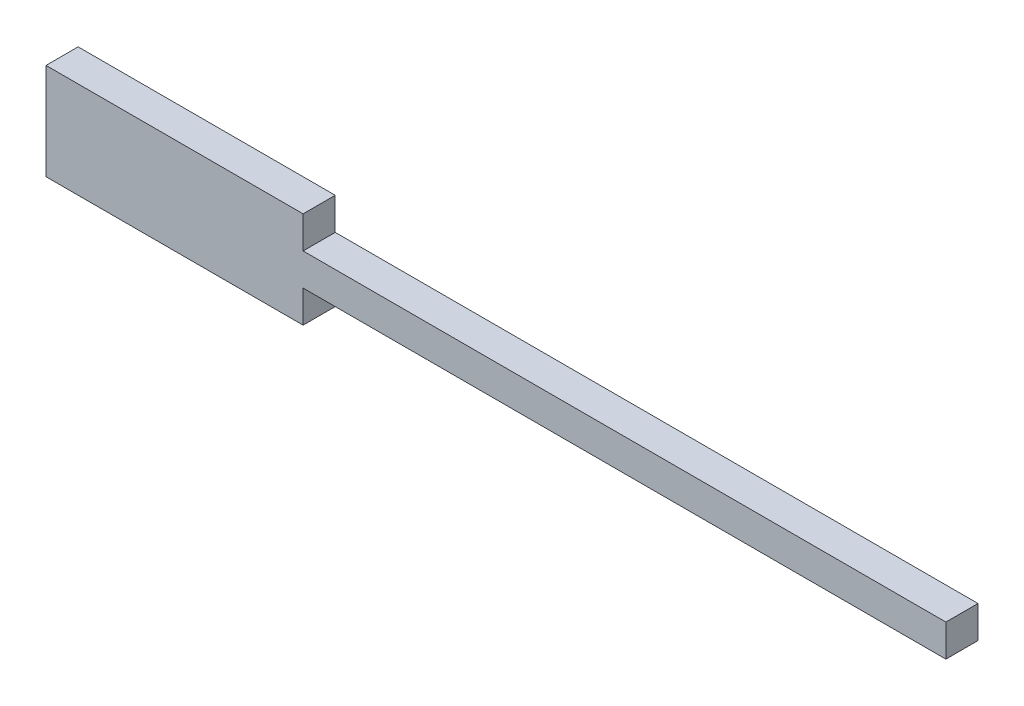
ISO-10303-21;
HEADER;
FILE_DESCRIPTION(('STEP AP214'),'2;1');
FILE_NAME('part.step','',(''),(''),'','','');
FILE_SCHEMA(('AUTOMOTIVE_DESIGN { 1 0 10303 214 1 1 1 1 }'));
ENDSEC;
DATA;
#1=APPLICATION_CONTEXT('core data for automotive mechanical design processes');
#2=APPLICATION_PROTOCOL_DEFINITION('international standard','automotive_design',2000,#1);
#3=PRODUCT_CONTEXT('',#1,'mechanical');
#4=PRODUCT('Part','Part','',(#3));
#5=PRODUCT_RELATED_PRODUCT_CATEGORY('part','',(#4));
#6=PRODUCT_DEFINITION_FORMATION('','',#4);
#7=PRODUCT_DEFINITION_CONTEXT('part definition',#1,'design');
#8=PRODUCT_DEFINITION('design','',#6,#7);
#9=PRODUCT_DEFINITION_SHAPE('','',#8);
#10=(LENGTH_UNIT() NAMED_UNIT(*) SI_UNIT(.MILLI.,.METRE.));
#11=(NAMED_UNIT(*) PLANE_ANGLE_UNIT() SI_UNIT($,.RADIAN.));
#12=(NAMED_UNIT(*) SI_UNIT($,.STERADIAN.) SOLID_ANGLE_UNIT());
#13=UNCERTAINTY_MEASURE_WITH_UNIT(LENGTH_MEASURE(1.E-05),#10,'distance_accuracy_value','');
#14=(GEOMETRIC_REPRESENTATION_CONTEXT(3) GLOBAL_UNCERTAINTY_ASSIGNED_CONTEXT((#13)) GLOBAL_UNIT_ASSIGNED_CONTEXT((#10,
#11,#12)) REPRESENTATION_CONTEXT('',''));
#15=CARTESIAN_POINT('',(0.,0.,0.));
#16=DIRECTION('',(0.,0.,1.));
#17=DIRECTION('',(1.,0.,0.));
#18=AXIS2_PLACEMENT_3D('',#15,#16,#17);
#19=CARTESIAN_POINT('',(-54.0934530638892,0.,5.));
#20=DIRECTION('',(1.,0.,0.));
#21=DIRECTION('',(0.,0.,-1.));
#22=AXIS2_PLACEMENT_3D('',#19,#20,#21);
#23=PLANE('',#22);
#24=DIRECTION('',(0.,-1.,0.));
#25=VECTOR('',#24,1.);
#26=CARTESIAN_POINT('',(-54.0934530638892,0.,0.));
#27=LINE('',#26,#25);
#28=CARTESIAN_POINT('',(-54.0934530638892,15.,0.));
#29=VERTEX_POINT('',#28);
#30=CARTESIAN_POINT('',(-54.0934530638892,0.,0.));
#31=VERTEX_POINT('',#30);
#32=EDGE_CURVE('E131',#29,#31,#27,.T.);
#33=ORIENTED_EDGE('',*,*,#32,.T.);
#34=DIRECTION('',(0.,0.,-1.));
#35=VECTOR('',#34,1.);
#36=CARTESIAN_POINT('',(-54.0934530638892,0.,5.));
#37=LINE('',#36,#35);
#38=CARTESIAN_POINT('',(-54.0934530638892,0.,5.));
#39=VERTEX_POINT('',#38);
#40=EDGE_CURVE('E11',#39,#31,#37,.T.);
#41=ORIENTED_EDGE('',*,*,#40,.F.);
#42=DIRECTION('',(0.,-1.,0.));
#43=VECTOR('',#42,1.);
#44=CARTESIAN_POINT('',(-54.0934530638892,0.,5.));
#45=LINE('',#44,#43);
#46=CARTESIAN_POINT('',(-54.0934530638892,15.,5.));
#47=VERTEX_POINT('',#46);
#48=EDGE_CURVE('E145',#47,#39,#45,.T.);
#49=ORIENTED_EDGE('',*,*,#48,.F.);
#50=DIRECTION('',(0.,0.,-1.));
#51=VECTOR('',#50,1.);
#52=CARTESIAN_POINT('',(-54.0934530638892,15.,5.));
#53=LINE('',#52,#51);
#54=EDGE_CURVE('E127',#47,#29,#53,.T.);
#55=ORIENTED_EDGE('',*,*,#54,.T.);
#56=EDGE_LOOP('',(#33,#41,#49,#55));
#57=FACE_BOUND('',#56,.T.);
#58=ADVANCED_FACE('F35',(#57),#23,.F.);
#59=CARTESIAN_POINT('',(-54.0934530638892,0.,5.));
#60=DIRECTION('',(0.,1.,0.));
#61=DIRECTION('',(0.,0.,1.));
#62=AXIS2_PLACEMENT_3D('',#59,#60,#61);
#63=PLANE('',#62);
#64=DIRECTION('',(1.,0.,0.));
#65=VECTOR('',#64,1.);
#66=CARTESIAN_POINT('',(-54.0934530638892,0.,0.));
#67=LINE('',#66,#65);
#68=CARTESIAN_POINT('',(-14.0934530638892,0.,0.));
#69=VERTEX_POINT('',#68);
#70=EDGE_CURVE('E134',#31,#69,#67,.T.);
#71=ORIENTED_EDGE('',*,*,#70,.T.);
#72=DIRECTION('',(0.,0.,-1.));
#73=VECTOR('',#72,1.);
#74=CARTESIAN_POINT('',(-14.0934530638892,0.,5.));
#75=LINE('',#74,#73);
#76=CARTESIAN_POINT('',(-14.0934530638892,0.,5.));
#77=VERTEX_POINT('',#76);
#78=EDGE_CURVE('E43',#77,#69,#75,.T.);
#79=ORIENTED_EDGE('',*,*,#78,.F.);
#80=DIRECTION('',(1.,0.,0.));
#81=VECTOR('',#80,1.);
#82=CARTESIAN_POINT('',(-54.0934530638892,0.,5.));
#83=LINE('',#82,#81);
#84=EDGE_CURVE('E94',#39,#77,#83,.T.);
#85=ORIENTED_EDGE('',*,*,#84,.F.);
#86=ORIENTED_EDGE('',*,*,#40,.T.);
#87=EDGE_LOOP('',(#71,#79,#85,#86));
#88=FACE_BOUND('',#87,.T.);
#89=ADVANCED_FACE('F180',(#88),#63,.F.);
#90=CARTESIAN_POINT('',(-14.0934530638892,4.99999999999999,5.));
#91=DIRECTION('',(-1.,0.,0.));
#92=DIRECTION('',(0.,0.,1.));
#93=AXIS2_PLACEMENT_3D('',#90,#91,#92);
#94=PLANE('',#93);
#95=DIRECTION('',(0.,1.,0.));
#96=VECTOR('',#95,1.);
#97=CARTESIAN_POINT('',(-14.0934530638892,4.99999999999999,0.));
#98=LINE('',#97,#96);
#99=CARTESIAN_POINT('',(-14.0934530638892,4.99999999999999,0.));
#100=VERTEX_POINT('',#99);
#101=EDGE_CURVE('E136',#69,#100,#98,.T.);
#102=ORIENTED_EDGE('',*,*,#101,.T.);
#103=DIRECTION('',(0.,0.,-1.));
#104=VECTOR('',#103,1.);
#105=CARTESIAN_POINT('',(-14.0934530638892,4.99999999999999,5.));
#106=LINE('',#105,#104);
#107=CARTESIAN_POINT('',(-14.0934530638892,4.99999999999999,5.));
#108=VERTEX_POINT('',#107);
#109=EDGE_CURVE('E152',#108,#100,#106,.T.);
#110=ORIENTED_EDGE('',*,*,#109,.F.);
#111=DIRECTION('',(0.,1.,0.));
#112=VECTOR('',#111,1.);
#113=CARTESIAN_POINT('',(-14.0934530638892,4.99999999999999,5.));
#114=LINE('',#113,#112);
#115=EDGE_CURVE('E160',#77,#108,#114,.T.);
#116=ORIENTED_EDGE('',*,*,#115,.F.);
#117=ORIENTED_EDGE('',*,*,#78,.T.);
#118=EDGE_LOOP('',(#102,#110,#116,#117));
#119=FACE_BOUND('',#118,.T.);
#120=ADVANCED_FACE('F158',(#119),#94,.F.);
#121=CARTESIAN_POINT('',(-14.0934530638892,4.99999999999999,5.));
#122=DIRECTION('',(0.,1.,0.));
#123=DIRECTION('',(-1.,0.,0.));
#124=AXIS2_PLACEMENT_3D('',#121,#122,#123);
#125=PLANE('',#124);
#126=DIRECTION('',(1.,0.,0.));
#127=VECTOR('',#126,1.);
#128=CARTESIAN_POINT('',(-14.0934530638892,4.99999999999999,0.));
#129=LINE('',#128,#127);
#130=CARTESIAN_POINT('',(85.9065469361109,5.00000000000006,0.));
#131=VERTEX_POINT('',#130);
#132=EDGE_CURVE('E138',#100,#131,#129,.T.);
#133=ORIENTED_EDGE('',*,*,#132,.T.);
#134=DIRECTION('',(0.,0.,-1.));
#135=VECTOR('',#134,1.);
#136=CARTESIAN_POINT('',(85.9065469361109,5.00000000000006,5.));
#137=LINE('',#136,#135);
#138=CARTESIAN_POINT('',(85.9065469361109,5.00000000000006,5.));
#139=VERTEX_POINT('',#138);
#140=EDGE_CURVE('E149',#139,#131,#137,.T.);
#141=ORIENTED_EDGE('',*,*,#140,.F.);
#142=DIRECTION('',(1.,0.,0.));
#143=VECTOR('',#142,1.);
#144=CARTESIAN_POINT('',(-14.0934530638892,4.99999999999999,5.));
#145=LINE('',#144,#143);
#146=EDGE_CURVE('E172',#108,#139,#145,.T.);
#147=ORIENTED_EDGE('',*,*,#146,.F.);
#148=ORIENTED_EDGE('',*,*,#109,.T.);
#149=EDGE_LOOP('',(#133,#141,#147,#148));
#150=FACE_BOUND('',#149,.T.);
#151=ADVANCED_FACE('F168',(#150),#125,.F.);
#152=CARTESIAN_POINT('',(85.9065469361109,9.99999999999999,5.));
#153=DIRECTION('',(-1.,0.,0.));
#154=DIRECTION('',(0.,0.,1.));
#155=AXIS2_PLACEMENT_3D('',#152,#153,#154);
#156=PLANE('',#155);
#157=DIRECTION('',(0.,1.,0.));
#158=VECTOR('',#157,1.);
#159=CARTESIAN_POINT('',(85.9065469361109,9.99999999999999,0.));
#160=LINE('',#159,#158);
#161=CARTESIAN_POINT('',(85.9065469361109,9.99999999999999,0.));
#162=VERTEX_POINT('',#161);
#163=EDGE_CURVE('E140',#131,#162,#160,.T.);
#164=ORIENTED_EDGE('',*,*,#163,.T.);
#165=DIRECTION('',(0.,0.,-1.));
#166=VECTOR('',#165,1.);
#167=CARTESIAN_POINT('',(85.9065469361109,9.99999999999999,5.));
#168=LINE('',#167,#166);
#169=CARTESIAN_POINT('',(85.9065469361109,9.99999999999999,5.));
#170=VERTEX_POINT('',#169);
#171=EDGE_CURVE('E122',#170,#162,#168,.T.);
#172=ORIENTED_EDGE('',*,*,#171,.F.);
#173=DIRECTION('',(0.,1.,0.));
#174=VECTOR('',#173,1.);
#175=CARTESIAN_POINT('',(85.9065469361109,9.99999999999999,5.));
#176=LINE('',#175,#174);
#177=EDGE_CURVE('E113',#139,#170,#176,.T.);
#178=ORIENTED_EDGE('',*,*,#177,.F.);
#179=ORIENTED_EDGE('',*,*,#140,.T.);
#180=EDGE_LOOP('',(#164,#172,#178,#179));
#181=FACE_BOUND('',#180,.T.);
#182=ADVANCED_FACE('F171',(#181),#156,.F.);
#183=CARTESIAN_POINT('',(-14.0934530638892,9.99999999999997,5.));
#184=DIRECTION('',(0.,-1.,0.));
#185=DIRECTION('',(1.,0.,0.));
#186=AXIS2_PLACEMENT_3D('',#183,#184,#185);
#187=PLANE('',#186);
#188=DIRECTION('',(-1.,0.,0.));
#189=VECTOR('',#188,1.);
#190=CARTESIAN_POINT('',(-14.0934530638892,9.99999999999997,0.));
#191=LINE('',#190,#189);
#192=CARTESIAN_POINT('',(-14.0934530638892,9.99999999999997,0.));
#193=VERTEX_POINT('',#192);
#194=EDGE_CURVE('E121',#162,#193,#191,.T.);
#195=ORIENTED_EDGE('',*,*,#194,.T.);
#196=DIRECTION('',(0.,0.,-1.));
#197=VECTOR('',#196,1.);
#198=CARTESIAN_POINT('',(-14.0934530638892,9.99999999999997,5.));
#199=LINE('',#198,#197);
#200=CARTESIAN_POINT('',(-14.0934530638892,9.99999999999997,5.));
#201=VERTEX_POINT('',#200);
#202=EDGE_CURVE('E118',#201,#193,#199,.T.);
#203=ORIENTED_EDGE('',*,*,#202,.F.);
#204=DIRECTION('',(-1.,0.,0.));
#205=VECTOR('',#204,1.);
#206=CARTESIAN_POINT('',(-14.0934530638892,9.99999999999997,5.));
#207=LINE('',#206,#205);
#208=EDGE_CURVE('E107',#170,#201,#207,.T.);
#209=ORIENTED_EDGE('',*,*,#208,.F.);
#210=ORIENTED_EDGE('',*,*,#171,.T.);
#211=EDGE_LOOP('',(#195,#203,#209,#210));
#212=FACE_BOUND('',#211,.T.);
#213=ADVANCED_FACE('F119',(#212),#187,.F.);
#214=CARTESIAN_POINT('',(-14.0934530638892,15.,5.));
#215=DIRECTION('',(-1.,0.,0.));
#216=DIRECTION('',(0.,-1.,0.));
#217=AXIS2_PLACEMENT_3D('',#214,#215,#216);
#218=PLANE('',#217);
#219=DIRECTION('',(0.,1.,0.));
#220=VECTOR('',#219,1.);
#221=CARTESIAN_POINT('',(-14.0934530638892,15.,0.));
#222=LINE('',#221,#220);
#223=CARTESIAN_POINT('',(-14.0934530638892,15.,0.));
#224=VERTEX_POINT('',#223);
#225=EDGE_CURVE('E80',#193,#224,#222,.T.);
#226=ORIENTED_EDGE('',*,*,#225,.T.);
#227=DIRECTION('',(0.,0.,-1.));
#228=VECTOR('',#227,1.);
#229=CARTESIAN_POINT('',(-14.0934530638892,15.,5.));
#230=LINE('',#229,#228);
#231=CARTESIAN_POINT('',(-14.0934530638892,15.,5.));
#232=VERTEX_POINT('',#231);
#233=EDGE_CURVE('E123',#232,#224,#230,.T.);
#234=ORIENTED_EDGE('',*,*,#233,.F.);
#235=DIRECTION('',(0.,1.,0.));
#236=VECTOR('',#235,1.);
#237=CARTESIAN_POINT('',(-14.0934530638892,15.,5.));
#238=LINE('',#237,#236);
#239=EDGE_CURVE('E111',#201,#232,#238,.T.);
#240=ORIENTED_EDGE('',*,*,#239,.F.);
#241=ORIENTED_EDGE('',*,*,#202,.T.);
#242=EDGE_LOOP('',(#226,#234,#240,#241));
#243=FACE_BOUND('',#242,.T.);
#244=ADVANCED_FACE('F125',(#243),#218,.F.);
#245=CARTESIAN_POINT('',(-54.0934530638892,15.,5.));
#246=DIRECTION('',(0.,-1.,0.));
#247=DIRECTION('',(0.,0.,-1.));
#248=AXIS2_PLACEMENT_3D('',#245,#246,#247);
#249=PLANE('',#248);
#250=DIRECTION('',(-1.,0.,0.));
#251=VECTOR('',#250,1.);
#252=CARTESIAN_POINT('',(-54.0934530638892,15.,0.));
#253=LINE('',#252,#251);
#254=EDGE_CURVE('E86',#224,#29,#253,.T.);
#255=ORIENTED_EDGE('',*,*,#254,.T.);
#256=ORIENTED_EDGE('',*,*,#54,.F.);
#257=DIRECTION('',(-1.,0.,0.));
#258=VECTOR('',#257,1.);
#259=CARTESIAN_POINT('',(-54.0934530638892,15.,5.));
#260=LINE('',#259,#258);
#261=EDGE_CURVE('E51',#232,#47,#260,.T.);
#262=ORIENTED_EDGE('',*,*,#261,.F.);
#263=ORIENTED_EDGE('',*,*,#233,.T.);
#264=EDGE_LOOP('',(#255,#256,#262,#263));
#265=FACE_BOUND('',#264,.T.);
#266=ADVANCED_FACE('F196',(#265),#249,.F.);
#267=CARTESIAN_POINT('',(0.,0.,5.));
#268=DIRECTION('',(0.,0.,-1.));
#269=DIRECTION('',(-1.,0.,0.));
#270=AXIS2_PLACEMENT_3D('',#267,#268,#269);
#271=PLANE('',#270);
#272=ORIENTED_EDGE('',*,*,#48,.T.);
#273=ORIENTED_EDGE('',*,*,#84,.T.);
#274=ORIENTED_EDGE('',*,*,#115,.T.);
#275=ORIENTED_EDGE('',*,*,#146,.T.);
#276=ORIENTED_EDGE('',*,*,#177,.T.);
#277=ORIENTED_EDGE('',*,*,#208,.T.);
#278=ORIENTED_EDGE('',*,*,#239,.T.);
#279=ORIENTED_EDGE('',*,*,#261,.T.);
#280=EDGE_LOOP('',(#272,#273,#274,#275,#276,#277,#278,#279));
#281=FACE_BOUND('',#280,.T.);
#282=ADVANCED_FACE('F109',(#281),#271,.F.);
#283=CARTESIAN_POINT('',(0.,0.,0.));
#284=DIRECTION('',(0.,0.,-1.));
#285=DIRECTION('',(-1.,0.,0.));
#286=AXIS2_PLACEMENT_3D('',#283,#284,#285);
#287=PLANE('',#286);
#288=ORIENTED_EDGE('',*,*,#32,.F.);
#289=ORIENTED_EDGE('',*,*,#254,.F.);
#290=ORIENTED_EDGE('',*,*,#225,.F.);
#291=ORIENTED_EDGE('',*,*,#194,.F.);
#292=ORIENTED_EDGE('',*,*,#163,.F.);
#293=ORIENTED_EDGE('',*,*,#132,.F.);
#294=ORIENTED_EDGE('',*,*,#101,.F.);
#295=ORIENTED_EDGE('',*,*,#70,.F.);
#296=EDGE_LOOP('',(#288,#289,#290,#291,#292,#293,#294,#295));
#297=FACE_BOUND('',#296,.T.);
#298=ADVANCED_FACE('F164',(#297),#287,.T.);
#299=CLOSED_SHELL('',(#58,#89,#120,#151,#182,#213,#244,#266,#282,#298));
#300=MANIFOLD_SOLID_BREP('B2',#299);
#301=ADVANCED_BREP_SHAPE_REPRESENTATION('',(#18,#300),#14);
#302=SHAPE_DEFINITION_REPRESENTATION(#9,#301);
ENDSEC;
END-ISO-10303-21;
